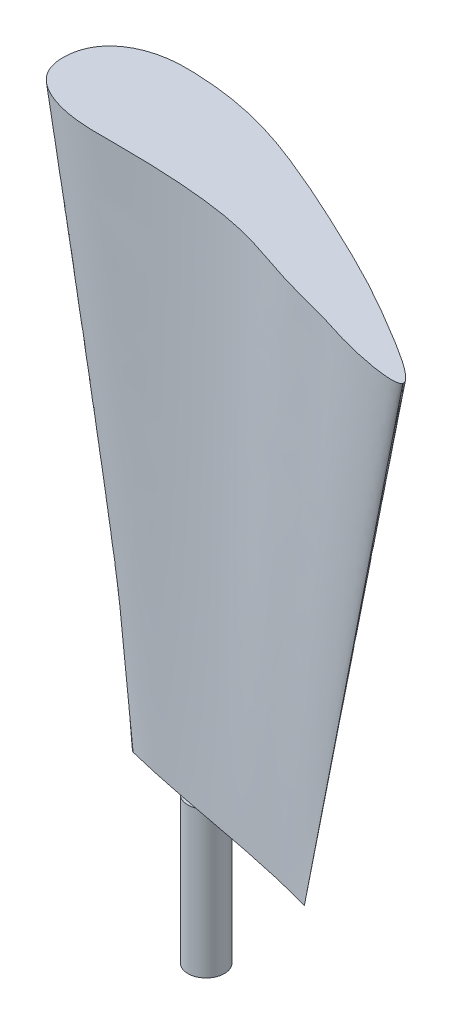
ISO-10303-21;
HEADER;
FILE_DESCRIPTION(('STEP AP214'),'2;1');
FILE_NAME('part.step','',(''),(''),'','','');
FILE_SCHEMA(('AUTOMOTIVE_DESIGN { 1 0 10303 214 1 1 1 1 }'));
ENDSEC;
DATA;
#1=APPLICATION_CONTEXT('core data for automotive mechanical design processes');
#2=APPLICATION_PROTOCOL_DEFINITION('international standard','automotive_design',2000,#1);
#3=PRODUCT_CONTEXT('',#1,'mechanical');
#4=PRODUCT('Part','Part','',(#3));
#5=PRODUCT_RELATED_PRODUCT_CATEGORY('part','',(#4));
#6=PRODUCT_DEFINITION_FORMATION('','',#4);
#7=PRODUCT_DEFINITION_CONTEXT('part definition',#1,'design');
#8=PRODUCT_DEFINITION('design','',#6,#7);
#9=PRODUCT_DEFINITION_SHAPE('','',#8);
#10=(LENGTH_UNIT() NAMED_UNIT(*) SI_UNIT(.MILLI.,.METRE.));
#11=(NAMED_UNIT(*) PLANE_ANGLE_UNIT() SI_UNIT($,.RADIAN.));
#12=(NAMED_UNIT(*) SI_UNIT($,.STERADIAN.) SOLID_ANGLE_UNIT());
#13=UNCERTAINTY_MEASURE_WITH_UNIT(LENGTH_MEASURE(1.E-05),#10,'distance_accuracy_value','');
#14=(GEOMETRIC_REPRESENTATION_CONTEXT(3) GLOBAL_UNCERTAINTY_ASSIGNED_CONTEXT((#13)) GLOBAL_UNIT_ASSIGNED_CONTEXT((#10,
#11,#12)) REPRESENTATION_CONTEXT('',''));
#15=CARTESIAN_POINT('',(0.,0.,0.));
#16=DIRECTION('',(0.,0.,1.));
#17=DIRECTION('',(1.,0.,0.));
#18=AXIS2_PLACEMENT_3D('',#15,#16,#17);
#19=CARTESIAN_POINT('',(0.,4.,0.));
#20=DIRECTION('',(0.,-1.,0.));
#21=DIRECTION('',(0.,0.,-1.));
#22=AXIS2_PLACEMENT_3D('',#19,#20,#21);
#23=CYLINDRICAL_SURFACE('',#22,0.5);
#24=CARTESIAN_POINT('',(0.,4.,0.));
#25=DIRECTION('',(0.,1.,0.));
#26=DIRECTION('',(0.,0.,1.));
#27=AXIS2_PLACEMENT_3D('',#24,#25,#26);
#28=CIRCLE('',#27,0.5);
#29=CARTESIAN_POINT('',(0.181224183875276,4.,0.466001926154282));
#30=VERTEX_POINT('',#29);
#31=CARTESIAN_POINT('',(-0.342594190727988,4.,0.364182949188227));
#32=VERTEX_POINT('',#31);
#33=EDGE_CURVE('E62',#30,#32,#28,.T.);
#34=ORIENTED_EDGE('',*,*,#33,.F.);
#35=EDGE_CURVE('E133',#32,#30,#28,.T.);
#36=ORIENTED_EDGE('',*,*,#35,.F.);
#37=EDGE_LOOP('',(#34,#36));
#38=FACE_BOUND('',#37,.T.);
#39=CARTESIAN_POINT('',(0.,0.,0.));
#40=DIRECTION('',(0.,1.,0.));
#41=DIRECTION('',(0.,0.,1.));
#42=AXIS2_PLACEMENT_3D('',#39,#40,#41);
#43=CIRCLE('',#42,0.5);
#44=CARTESIAN_POINT('',(0.,0.,0.5));
#45=VERTEX_POINT('',#44);
#46=EDGE_CURVE('E56',#45,#45,#43,.T.);
#47=ORIENTED_EDGE('',*,*,#46,.T.);
#48=EDGE_LOOP('',(#47));
#49=FACE_BOUND('',#48,.T.);
#50=ADVANCED_FACE('F53',(#38,#49),#23,.T.);
#51=CARTESIAN_POINT('',(0.,4.,0.));
#52=DIRECTION('',(0.,1.,0.));
#53=DIRECTION('',(0.,0.,1.));
#54=AXIS2_PLACEMENT_3D('',#51,#52,#53);
#55=PLANE('',#54);
#56=CARTESIAN_POINT('',(-2.,4.,0.));
#57=CARTESIAN_POINT('',(-0.0191301431504497,4.,0.494531291696715));
#58=CARTESIAN_POINT('',(2.01588478753909,4.,0.730518045458779));
#59=CARTESIAN_POINT('',(3.98237539842367,4.,1.29395220474122));
#60=B_SPLINE_CURVE_WITH_KNOTS('',3,(#56,#57,#58,#59),.UNSPECIFIED.,.F.,.F.,(4,4),(0.,1.),.UNSPECIFIED.);
#61=EDGE_CURVE('E11',#32,#30,#60,.T.);
#62=ORIENTED_EDGE('',*,*,#61,.F.);
#63=ORIENTED_EDGE('',*,*,#35,.T.);
#64=EDGE_LOOP('',(#62,#63));
#65=FACE_BOUND('',#64,.T.);
#66=ADVANCED_FACE('F143',(#65),#55,.T.);
#67=CARTESIAN_POINT('',(0.,0.,0.));
#68=DIRECTION('',(0.,1.,0.));
#69=DIRECTION('',(0.,0.,1.));
#70=AXIS2_PLACEMENT_3D('',#67,#68,#69);
#71=PLANE('',#70);
#72=ORIENTED_EDGE('',*,*,#46,.F.);
#73=EDGE_LOOP('',(#72));
#74=FACE_BOUND('',#73,.T.);
#75=ADVANCED_FACE('F140',(#74),#71,.F.);
#76=CARTESIAN_POINT('',(-4.33953243787735,19.,-1.01684201498652));
#77=DIRECTION('',(0.,-1.,0.));
#78=DIRECTION('',(0.,0.,-1.));
#79=AXIS2_PLACEMENT_3D('',#76,#77,#78);
#80=PLANE('',#79);
#81=CARTESIAN_POINT('',(7.9384724358658,19.,2.57415657120789));
#82=CARTESIAN_POINT('',(8.05205857616093,19.,2.41207726140518));
#83=CARTESIAN_POINT('',(6.27259587405626,19.,1.3214482527566));
#84=CARTESIAN_POINT('',(4.94429704168154,19.,0.565746790660222));
#85=CARTESIAN_POINT('',(3.06892453485552,19.,-0.342283147458297));
#86=CARTESIAN_POINT('',(1.37093195380685,19.,-1.1035008372868));
#87=CARTESIAN_POINT('',(-0.391868942833087,19.,-1.75215412132988));
#88=CARTESIAN_POINT('',(-1.88159137967984,19.,-1.96843077841407));
#89=CARTESIAN_POINT('',(-3.2886984406922,19.,-1.95087581816075));
#90=CARTESIAN_POINT('',(-4.43247240955041,19.,-1.3607722820396));
#91=CARTESIAN_POINT('',(-4.52823297484507,19.,0.204653689333281));
#92=CARTESIAN_POINT('',(-3.12421980669427,19.,0.833691627576655));
#93=CARTESIAN_POINT('',(-1.42226488997921,19.,0.797143301790134));
#94=CARTESIAN_POINT('',(0.430553453189666,19.,0.848586825293784));
#95=CARTESIAN_POINT('',(2.36068660163328,19.,1.14455407986323));
#96=CARTESIAN_POINT('',(3.78819209097398,19.,1.71762078927066));
#97=CARTESIAN_POINT('',(5.2231155341075,19.,2.0367921648835));
#98=CARTESIAN_POINT('',(6.310537614646,19.,2.44535872203273));
#99=CARTESIAN_POINT('',(7.84015358771247,19.,2.71445054552454));
#100=CARTESIAN_POINT('',(7.9384724358658,19.,2.57415657120789));
#101=B_SPLINE_CURVE_WITH_KNOTS('',3,(#81,#82,#83,#84,#85,#86,#87,#88,#89,#90,#91,#92,#93,#94,
#95,#96,#97,#98,#99,#100),.UNSPECIFIED.,.T.,.F.,(4,1,1,1,1,1,1,1,1,1,1,1,1,1,1,1,1,4),(0.,
0.0665247718269159,0.131828125504594,0.207047524425357,0.282760083658302,0.339061354406076,
0.411874793776142,0.445944204777281,0.493897612791513,0.536809227526431,0.585723026593117,
0.638639869739141,0.727319020587031,0.787415383751123,0.851165733640017,0.897129763548696,
0.942416927604972,1.),.UNSPECIFIED.);
#102=CARTESIAN_POINT('',(7.94591208782924,19.,2.55882573512214));
#103=VERTEX_POINT('',#102);
#104=CARTESIAN_POINT('',(-4.42273297348145,19.,-0.693782031848014));
#105=VERTEX_POINT('',#104);
#106=EDGE_CURVE('E125',#103,#105,#101,.T.);
#107=ORIENTED_EDGE('',*,*,#106,.T.);
#108=EDGE_CURVE('E95',#105,#103,#101,.T.);
#109=ORIENTED_EDGE('',*,*,#108,.T.);
#110=EDGE_LOOP('',(#107,#109));
#111=FACE_BOUND('',#110,.T.);
#112=ADVANCED_FACE('F142',(#111),#80,.F.);
#113=CARTESIAN_POINT('',(0.9965799164487,4.,0.621137527025963));
#114=DIRECTION('',(0.,-1.,0.));
#115=DIRECTION('',(0.,0.,-1.));
#116=AXIS2_PLACEMENT_3D('',#113,#114,#115);
#117=PLANE('',#116);
#118=CARTESIAN_POINT('',(3.98237539842367,4.,1.29395220474122));
#119=VERTEX_POINT('',#118);
#120=EDGE_CURVE('E65',#30,#119,#60,.T.);
#121=ORIENTED_EDGE('',*,*,#120,.F.);
#122=ORIENTED_EDGE('',*,*,#33,.T.);
#123=CARTESIAN_POINT('',(-2.,4.,0.));
#124=VERTEX_POINT('',#123);
#125=EDGE_CURVE('E64',#124,#32,#60,.T.);
#126=ORIENTED_EDGE('',*,*,#125,.F.);
#127=CARTESIAN_POINT('',(3.98237539842367,4.,1.29395220474122));
#128=CARTESIAN_POINT('',(3.64903618163204,4.,0.880965654555481));
#129=CARTESIAN_POINT('',(2.96620430349201,4.,0.567439705881042));
#130=CARTESIAN_POINT('',(1.94908782238357,4.,0.109312673509461));
#131=CARTESIAN_POINT('',(1.15686337985472,4.,-0.182376728969348));
#132=CARTESIAN_POINT('',(0.304140138701309,4.,-0.573158725633311));
#133=CARTESIAN_POINT('',(-0.435586518270291,4.,-0.839326203251141));
#134=CARTESIAN_POINT('',(-1.21304958520534,4.,-0.989768915807466));
#135=CARTESIAN_POINT('',(-2.14839145782024,4.,-1.0351942862684));
#136=CARTESIAN_POINT('',(-2.35739199357133,4.,-0.217091770706076));
#137=CARTESIAN_POINT('',(-2.,4.,0.));
#138=B_SPLINE_CURVE_WITH_KNOTS('',3,(#127,#128,#129,#130,#131,#132,#133,#134,#135,#136,#137),
.UNSPECIFIED.,.F.,.F.,(4,1,1,1,1,1,1,1,4),(0.,0.206989258423122,0.296675286082545,
0.449001508533219,0.545040750943274,0.674317155768986,0.759992591851444,0.872553131404666,1.),.UNSPECIFIED.);
#139=EDGE_CURVE('E103',#119,#124,#138,.T.);
#140=ORIENTED_EDGE('',*,*,#139,.F.);
#141=EDGE_LOOP('',(#121,#122,#126,#140));
#142=FACE_BOUND('',#141,.T.);
#143=ADVANCED_FACE('F109',(#142),#117,.T.);
#144=CARTESIAN_POINT('',(3.98237539842367,4.,1.29395220474122));
#145=CARTESIAN_POINT('',(7.94591208782913,19.,2.55882573512252));
#146=CARTESIAN_POINT('',(3.77834225468069,4.,1.04116783400624));
#147=CARTESIAN_POINT('',(7.99932667839683,19.,2.37976621907044));
#148=CARTESIAN_POINT('',(3.35743146965565,4.,0.747073774449693));
#149=CARTESIAN_POINT('',(6.58661723063864,19.,1.51436215654283));
#150=CARTESIAN_POINT('',(2.77483570168336,4.,0.481725971223352));
#151=CARTESIAN_POINT('',(5.58330843274097,19.,0.929295888762284));
#152=CARTESIAN_POINT('',(2.38891290343933,4.,0.307417573871589));
#153=CARTESIAN_POINT('',(4.97065973733245,19.,0.599281473340482));
#154=CARTESIAN_POINT('',(1.94311966497215,4.,0.114072033168648));
#155=CARTESIAN_POINT('',(4.19304649868821,19.,0.202001464554181));
#156=CARTESIAN_POINT('',(1.49102932309945,4.,-0.0593400501177318));
#157=CARTESIAN_POINT('',(3.34162858697914,19.,-0.206134907134151));
#158=CARTESIAN_POINT('',(0.918025903998466,4.,-0.291830044170472));
#159=CARTESIAN_POINT('',(2.28369867470414,19.,-0.693976722758551));
#160=CARTESIAN_POINT('',(0.582544384072667,4.,-0.445572937378279));
#161=CARTESIAN_POINT('',(1.65744639353615,19.,-0.966026664454884));
#162=CARTESIAN_POINT('',(0.0911079806825182,4.,-0.648252811680856));
#163=CARTESIAN_POINT('',(0.745558302493588,19.,-1.33361796137697));
#164=CARTESIAN_POINT('',(-0.215529223167753,4.,-0.758866155017744));
#165=CARTESIAN_POINT('',(0.17858574515037,19.,-1.54224538605323));
#166=CARTESIAN_POINT('',(-0.712050382546998,4.,-0.892823244376911));
#167=CARTESIAN_POINT('',(-0.764999990536124,19.,-1.78405609222891));
#168=CARTESIAN_POINT('',(-1.05123512324145,4.,-0.958457066249571));
#169=CARTESIAN_POINT('',(-1.42352148135941,19.,-1.89753540923184));
#170=CARTESIAN_POINT('',(-1.58306593277982,4.,-1.00758396008455));
#171=CARTESIAN_POINT('',(-2.33770257332754,19.,-1.96274036998856));
#172=CARTESIAN_POINT('',(-1.86492875735281,4.,-0.950412973417872));
#173=CARTESIAN_POINT('',(-2.8589788082329,19.,-1.956236967484));
#174=CARTESIAN_POINT('',(-2.17788492805159,4.,-0.70814410879587));
#175=CARTESIAN_POINT('',(-3.606715654749,19.,-1.78680224447236));
#176=CARTESIAN_POINT('',(-2.32721291208693,4.,-0.335223441474404));
#177=CARTESIAN_POINT('',(-4.2033301697294,19.,-1.47376425379211));
#178=CARTESIAN_POINT('',(-2.09718492752624,4.,-0.0590333538023214));
#179=CARTESIAN_POINT('',(-4.40069117111406,19.,-0.86328773168461));
#180=CARTESIAN_POINT('',(-2.,4.,0.));
#181=CARTESIAN_POINT('',(-4.42273297348163,19.,-0.693782031846617));
#182=B_SPLINE_SURFACE_WITH_KNOTS('',3,1,((#144,#145),(#146,#147),(#148,#149),(#150,#151),(#152,
#153),(#154,#155),(#156,#157),(#158,#159),(#160,#161),(#162,#163),(#164,#165),(#166,#167),(#168,
#169),(#170,#171),(#172,#173),(#174,#175),(#176,#177),(#178,#179),(#180,#181)),.UNSPECIFIED.,
.F.,.F.,.F.,(4,1,1,1,1,1,1,1,1,1,1,1,1,1,1,1,4),(2,2),(0.,0.126695771123435,0.206989258423122,
0.254842699239746,0.296675286082545,0.402448210497677,0.449001508533219,0.545040750943274,
0.551021466526985,0.661503309940155,0.674317155768986,0.759992591851444,0.804387527294625,
0.871243057932103,0.872553131404666,0.965343614544594,1.),(0.,1.),.UNSPECIFIED.);
#183=DIRECTION('',(-0.159283169560126,0.986178654252752,-0.0456128687007491));
#184=VECTOR('',#183,1.);
#185=CARTESIAN_POINT('',(-3.21136648674082,11.5,-0.346891015923309));
#186=LINE('',#185,#184);
#187=EDGE_CURVE('E90',#124,#105,#186,.T.);
#188=DIRECTION('',(-0.254623003525063,-0.963620461262552,-0.0812572009856543));
#189=VECTOR('',#188,1.);
#190=CARTESIAN_POINT('',(5.9641437431264,11.5,1.92638896993187));
#191=LINE('',#190,#189);
#192=EDGE_CURVE('E99',#103,#119,#191,.T.);
#193=ORIENTED_EDGE('',*,*,#139,.T.);
#194=ORIENTED_EDGE('',*,*,#187,.T.);
#195=ORIENTED_EDGE('',*,*,#106,.F.);
#196=ORIENTED_EDGE('',*,*,#192,.T.);
#197=EDGE_LOOP('',(#193,#194,#195,#196));
#198=FACE_BOUND('',#197,.T.);
#199=ADVANCED_FACE('F104',(#198),#182,.T.);
#200=CARTESIAN_POINT('',(-2.,4.,0.));
#201=CARTESIAN_POINT('',(-4.42273297348163,19.,-0.693782031846617));
#202=CARTESIAN_POINT('',(-1.8980050815396,4.,0.0254633986166785));
#203=CARTESIAN_POINT('',(-4.4542475753092,19.,-0.451428682115274));
#204=CARTESIAN_POINT('',(-1.59801232472249,4.,0.0982391406538004));
#205=CARTESIAN_POINT('',(-4.35692152471315,19.,0.281406104362548));
#206=CARTESIAN_POINT('',(-1.08209872834479,4.,0.213990907774696));
#207=CARTESIAN_POINT('',(-3.12421980669427,19.,0.833691627576655));
#208=CARTESIAN_POINT('',(-0.305813383375745,4.,0.373809130719051));
#209=CARTESIAN_POINT('',(-1.42226488997921,19.,0.797143301790134));
#210=CARTESIAN_POINT('',(0.518693330923773,4.,0.530338625406962));
#211=CARTESIAN_POINT('',(0.430553453189666,19.,0.848586825293784));
#212=CARTESIAN_POINT('',(1.38750975970395,4.,0.695180106445555));
#213=CARTESIAN_POINT('',(2.36068660163328,19.,1.14455407986323));
#214=CARTESIAN_POINT('',(2.08040535158141,4.,0.833106397521853));
#215=CARTESIAN_POINT('',(3.78819209097398,19.,1.71762078927066));
#216=CARTESIAN_POINT('',(2.71069525711156,4.,0.969417149371343));
#217=CARTESIAN_POINT('',(5.2231155341075,19.,2.0367921648835));
#218=CARTESIAN_POINT('',(3.3135179933698,4.,1.11172203098141));
#219=CARTESIAN_POINT('',(6.310537614646,19.,2.44535872203273));
#220=CARTESIAN_POINT('',(3.7357103363943,4.,1.22344683390367));
#221=CARTESIAN_POINT('',(7.86931130094277,19.,2.71958000439536));
#222=CARTESIAN_POINT('',(3.97451218639567,4.,1.29169925614654));
#223=CARTESIAN_POINT('',(7.94428978738284,19.,2.56426410560734));
#224=CARTESIAN_POINT('',(3.98237539842367,4.,1.29395220474122));
#225=CARTESIAN_POINT('',(7.94591208782913,19.,2.55882573512252));
#226=B_SPLINE_SURFACE_WITH_KNOTS('',3,1,((#200,#201),(#202,#203),(#204,#205),(#206,#207),(#208,
#209),(#210,#211),(#212,#213),(#214,#215),(#216,#217),(#218,#219),(#220,#221),(#222,#223),(#224,
#225)),.UNSPECIFIED.,.F.,.F.,.F.,(4,1,1,1,1,1,1,1,1,1,4),(2,2),(0.,0.0514899644253338,
0.15123211227237,0.25913703262978,0.439966351627491,0.56251132777236,0.692507299159686,
0.786234450889339,0.878581377504378,0.996001398641585,1.),(0.,1.),.UNSPECIFIED.);
#227=ORIENTED_EDGE('',*,*,#125,.T.);
#228=ORIENTED_EDGE('',*,*,#61,.T.);
#229=ORIENTED_EDGE('',*,*,#120,.T.);
#230=ORIENTED_EDGE('',*,*,#192,.F.);
#231=ORIENTED_EDGE('',*,*,#108,.F.);
#232=ORIENTED_EDGE('',*,*,#187,.F.);
#233=EDGE_LOOP('',(#227,#228,#229,#230,#231,#232));
#234=FACE_BOUND('',#233,.T.);
#235=ADVANCED_FACE('F92',(#234),#226,.T.);
#236=CLOSED_SHELL('',(#50,#66,#75,#112,#143,#199,#235));
#237=MANIFOLD_SOLID_BREP('B2',#236);
#238=ADVANCED_BREP_SHAPE_REPRESENTATION('',(#18,#237),#14);
#239=SHAPE_DEFINITION_REPRESENTATION(#9,#238);
ENDSEC;
END-ISO-10303-21;
